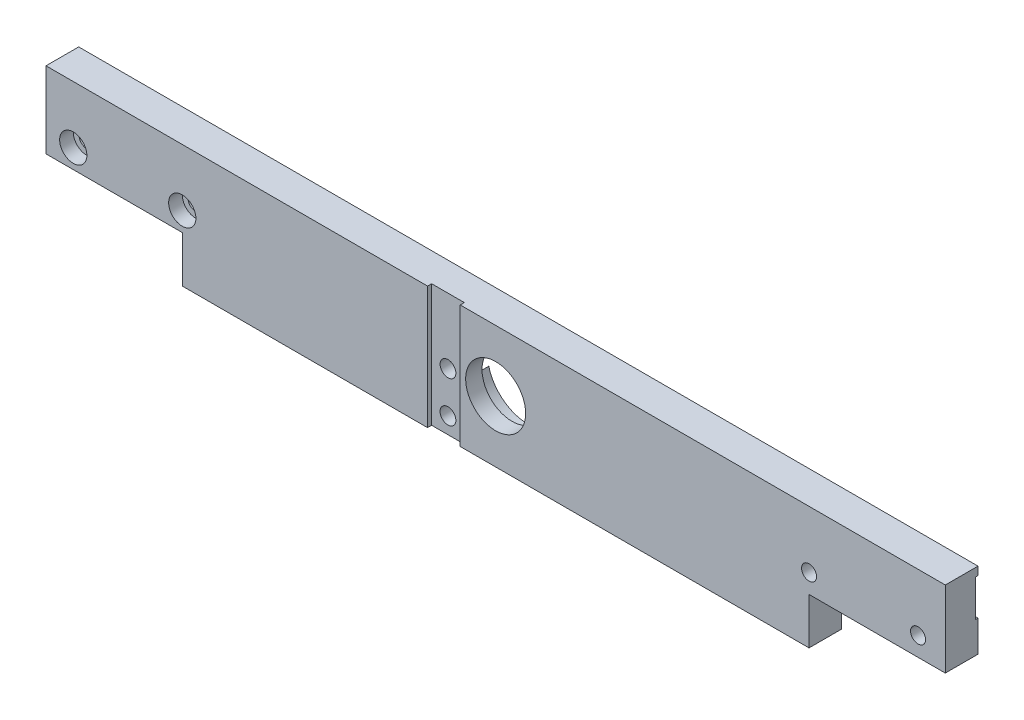
ISO-10303-21;
HEADER;
FILE_DESCRIPTION(('STEP AP214'),'2;1');
FILE_NAME('part.step','',(''),(''),'','','');
FILE_SCHEMA(('AUTOMOTIVE_DESIGN { 1 0 10303 214 1 1 1 1 }'));
ENDSEC;
DATA;
#1=APPLICATION_CONTEXT('core data for automotive mechanical design processes');
#2=APPLICATION_PROTOCOL_DEFINITION('international standard','automotive_design',2000,#1);
#3=PRODUCT_CONTEXT('',#1,'mechanical');
#4=PRODUCT('Part','Part','',(#3));
#5=PRODUCT_RELATED_PRODUCT_CATEGORY('part','',(#4));
#6=PRODUCT_DEFINITION_FORMATION('','',#4);
#7=PRODUCT_DEFINITION_CONTEXT('part definition',#1,'design');
#8=PRODUCT_DEFINITION('design','',#6,#7);
#9=PRODUCT_DEFINITION_SHAPE('','',#8);
#10=(LENGTH_UNIT() NAMED_UNIT(*) SI_UNIT(.MILLI.,.METRE.));
#11=(NAMED_UNIT(*) PLANE_ANGLE_UNIT() SI_UNIT($,.RADIAN.));
#12=(NAMED_UNIT(*) SI_UNIT($,.STERADIAN.) SOLID_ANGLE_UNIT());
#13=UNCERTAINTY_MEASURE_WITH_UNIT(LENGTH_MEASURE(1.E-05),#10,'distance_accuracy_value','');
#14=(GEOMETRIC_REPRESENTATION_CONTEXT(3) GLOBAL_UNCERTAINTY_ASSIGNED_CONTEXT((#13)) GLOBAL_UNIT_ASSIGNED_CONTEXT((#10,
#11,#12)) REPRESENTATION_CONTEXT('',''));
#15=CARTESIAN_POINT('',(0.,0.,0.));
#16=DIRECTION('',(0.,0.,1.));
#17=DIRECTION('',(1.,0.,0.));
#18=AXIS2_PLACEMENT_3D('',#15,#16,#17);
#19=CARTESIAN_POINT('',(165.,22.5,0.));
#20=DIRECTION('',(0.,0.,1.));
#21=DIRECTION('',(1.,0.,0.));
#22=AXIS2_PLACEMENT_3D('',#19,#20,#21);
#23=CYLINDRICAL_SURFACE('',#22,11.);
#24=CARTESIAN_POINT('',(165.,22.5,12.));
#25=DIRECTION('',(0.,0.,1.));
#26=DIRECTION('',(1.,0.,0.));
#27=AXIS2_PLACEMENT_3D('',#24,#25,#26);
#28=CIRCLE('',#27,11.);
#29=CARTESIAN_POINT('',(176.,22.5,12.));
#30=VERTEX_POINT('',#29);
#31=EDGE_CURVE('E281',#30,#30,#28,.T.);
#32=ORIENTED_EDGE('',*,*,#31,.T.);
#33=EDGE_LOOP('',(#32));
#34=FACE_BOUND('',#33,.T.);
#35=CARTESIAN_POINT('',(165.,22.5,6.));
#36=DIRECTION('',(0.,0.,-1.));
#37=DIRECTION('',(-1.,0.,0.));
#38=AXIS2_PLACEMENT_3D('',#35,#36,#37);
#39=CIRCLE('',#38,11.);
#40=CARTESIAN_POINT('',(154.,22.5,6.));
#41=VERTEX_POINT('',#40);
#42=EDGE_CURVE('E213',#41,#41,#39,.F.);
#43=ORIENTED_EDGE('',*,*,#42,.F.);
#44=EDGE_LOOP('',(#43));
#45=FACE_BOUND('',#44,.T.);
#46=ADVANCED_FACE('F34',(#34,#45),#23,.F.);
#47=CARTESIAN_POINT('',(0.,45.,12.));
#48=DIRECTION('',(0.,0.,-1.));
#49=DIRECTION('',(-1.,0.,0.));
#50=AXIS2_PLACEMENT_3D('',#47,#48,#49);
#51=PLANE('',#50);
#52=CARTESIAN_POINT('',(50.,24.,12.));
#53=DIRECTION('',(0.,0.,1.));
#54=DIRECTION('',(1.,0.,0.));
#55=AXIS2_PLACEMENT_3D('',#52,#53,#54);
#56=CIRCLE('',#55,5.);
#57=CARTESIAN_POINT('',(55.,24.,12.));
#58=VERTEX_POINT('',#57);
#59=EDGE_CURVE('E337',#58,#58,#56,.T.);
#60=ORIENTED_EDGE('',*,*,#59,.F.);
#61=EDGE_LOOP('',(#60));
#62=FACE_BOUND('',#61,.T.);
#63=CARTESIAN_POINT('',(10.,24.,12.));
#64=DIRECTION('',(0.,0.,1.));
#65=DIRECTION('',(1.,0.,0.));
#66=AXIS2_PLACEMENT_3D('',#63,#64,#65);
#67=CIRCLE('',#66,5.);
#68=CARTESIAN_POINT('',(15.,24.,12.));
#69=VERTEX_POINT('',#68);
#70=EDGE_CURVE('E321',#69,#69,#67,.T.);
#71=ORIENTED_EDGE('',*,*,#70,.F.);
#72=EDGE_LOOP('',(#71));
#73=FACE_BOUND('',#72,.T.);
#74=DIRECTION('',(1.,0.,0.));
#75=VECTOR('',#74,1.);
#76=CARTESIAN_POINT('',(0.,0.,12.));
#77=LINE('',#76,#75);
#78=CARTESIAN_POINT('',(50.,0.,12.));
#79=VERTEX_POINT('',#78);
#80=CARTESIAN_POINT('',(140.,0.,12.));
#81=VERTEX_POINT('',#80);
#82=EDGE_CURVE('E355',#79,#81,#77,.T.);
#83=ORIENTED_EDGE('',*,*,#82,.T.);
#84=DIRECTION('',(0.,-1.,0.));
#85=VECTOR('',#84,1.);
#86=CARTESIAN_POINT('',(140.,45.,12.));
#87=LINE('',#86,#85);
#88=CARTESIAN_POINT('',(140.,45.,12.));
#89=VERTEX_POINT('',#88);
#90=EDGE_CURVE('E239',#89,#81,#87,.T.);
#91=ORIENTED_EDGE('',*,*,#90,.F.);
#92=DIRECTION('',(-1.,0.,0.));
#93=VECTOR('',#92,1.);
#94=CARTESIAN_POINT('',(0.,45.,12.));
#95=LINE('',#94,#93);
#96=CARTESIAN_POINT('',(0.,45.,12.));
#97=VERTEX_POINT('',#96);
#98=EDGE_CURVE('E360',#89,#97,#95,.T.);
#99=ORIENTED_EDGE('',*,*,#98,.T.);
#100=DIRECTION('',(0.,-1.,0.));
#101=VECTOR('',#100,1.);
#102=CARTESIAN_POINT('',(0.,0.,12.));
#103=LINE('',#102,#101);
#104=CARTESIAN_POINT('',(0.,17.,12.));
#105=VERTEX_POINT('',#104);
#106=EDGE_CURVE('E350',#97,#105,#103,.T.);
#107=ORIENTED_EDGE('',*,*,#106,.T.);
#108=DIRECTION('',(-1.,0.,0.));
#109=VECTOR('',#108,1.);
#110=CARTESIAN_POINT('',(0.,17.,12.));
#111=LINE('',#110,#109);
#112=CARTESIAN_POINT('',(50.,17.,12.));
#113=VERTEX_POINT('',#112);
#114=EDGE_CURVE('E271',#113,#105,#111,.T.);
#115=ORIENTED_EDGE('',*,*,#114,.F.);
#116=DIRECTION('',(0.,1.,0.));
#117=VECTOR('',#116,1.);
#118=CARTESIAN_POINT('',(50.,0.,12.));
#119=LINE('',#118,#117);
#120=EDGE_CURVE('E263',#79,#113,#119,.T.);
#121=ORIENTED_EDGE('',*,*,#120,.F.);
#122=EDGE_LOOP('',(#83,#91,#99,#107,#115,#121));
#123=FACE_BOUND('',#122,.T.);
#124=ADVANCED_FACE('F428',(#62,#73,#123),#51,.F.);
#125=CARTESIAN_POINT('',(330.,28.5,0.));
#126=DIRECTION('',(0.,-1.,0.));
#127=DIRECTION('',(0.,0.,-1.));
#128=AXIS2_PLACEMENT_3D('',#125,#126,#127);
#129=PLANE('',#128);
#130=DIRECTION('',(-1.,0.,0.));
#131=VECTOR('',#130,1.);
#132=CARTESIAN_POINT('',(330.,28.5,0.));
#133=LINE('',#132,#131);
#134=CARTESIAN_POINT('',(330.,28.5,0.));
#135=VERTEX_POINT('',#134);
#136=CARTESIAN_POINT('',(178.747727084868,28.5,0.));
#137=VERTEX_POINT('',#136);
#138=EDGE_CURVE('E323',#135,#137,#133,.T.);
#139=ORIENTED_EDGE('',*,*,#138,.T.);
#140=DIRECTION('',(0.,0.,-1.));
#141=VECTOR('',#140,1.);
#142=CARTESIAN_POINT('',(178.747727084868,28.5,6.));
#143=LINE('',#142,#141);
#144=CARTESIAN_POINT('',(178.747727084868,28.5,1.));
#145=VERTEX_POINT('',#144);
#146=EDGE_CURVE('E218',#137,#145,#143,.F.);
#147=ORIENTED_EDGE('',*,*,#146,.T.);
#148=DIRECTION('',(-1.,0.,0.));
#149=VECTOR('',#148,1.);
#150=CARTESIAN_POINT('',(330.,28.5,1.));
#151=LINE('',#150,#149);
#152=CARTESIAN_POINT('',(330.,28.5,1.));
#153=VERTEX_POINT('',#152);
#154=EDGE_CURVE('E318',#153,#145,#151,.T.);
#155=ORIENTED_EDGE('',*,*,#154,.F.);
#156=DIRECTION('',(0.,0.,1.));
#157=VECTOR('',#156,1.);
#158=CARTESIAN_POINT('',(330.,28.5,0.));
#159=LINE('',#158,#157);
#160=EDGE_CURVE('E306',#135,#153,#159,.T.);
#161=ORIENTED_EDGE('',*,*,#160,.F.);
#162=EDGE_LOOP('',(#139,#147,#155,#161));
#163=FACE_BOUND('',#162,.T.);
#164=ADVANCED_FACE('F394',(#163),#129,.F.);
#165=CARTESIAN_POINT('',(330.,45.,1.));
#166=DIRECTION('',(0.,0.,1.));
#167=DIRECTION('',(0.,-1.,0.));
#168=AXIS2_PLACEMENT_3D('',#165,#166,#167);
#169=PLANE('',#168);
#170=ORIENTED_EDGE('',*,*,#154,.T.);
#171=CARTESIAN_POINT('',(165.,22.5,1.));
#172=DIRECTION('',(0.,0.,1.));
#173=DIRECTION('',(0.,-1.,0.));
#174=AXIS2_PLACEMENT_3D('',#171,#172,#173);
#175=CIRCLE('',#174,15.);
#176=CARTESIAN_POINT('',(151.252272915132,28.5,1.));
#177=VERTEX_POINT('',#176);
#178=EDGE_CURVE('E215',#145,#177,#175,.T.);
#179=ORIENTED_EDGE('',*,*,#178,.T.);
#180=CARTESIAN_POINT('',(0.,28.5,1.));
#181=VERTEX_POINT('',#180);
#182=EDGE_CURVE('E322',#177,#181,#151,.T.);
#183=ORIENTED_EDGE('',*,*,#182,.T.);
#184=DIRECTION('',(0.,1.,0.));
#185=VECTOR('',#184,1.);
#186=CARTESIAN_POINT('',(0.,45.,1.));
#187=LINE('',#186,#185);
#188=CARTESIAN_POINT('',(0.,42.,1.));
#189=VERTEX_POINT('',#188);
#190=EDGE_CURVE('E310',#181,#189,#187,.T.);
#191=ORIENTED_EDGE('',*,*,#190,.T.);
#192=DIRECTION('',(-1.,0.,0.));
#193=VECTOR('',#192,1.);
#194=CARTESIAN_POINT('',(330.,42.,1.));
#195=LINE('',#194,#193);
#196=CARTESIAN_POINT('',(330.,42.,1.));
#197=VERTEX_POINT('',#196);
#198=EDGE_CURVE('E287',#197,#189,#195,.T.);
#199=ORIENTED_EDGE('',*,*,#198,.F.);
#200=DIRECTION('',(0.,1.,0.));
#201=VECTOR('',#200,1.);
#202=CARTESIAN_POINT('',(330.,45.,1.));
#203=LINE('',#202,#201);
#204=EDGE_CURVE('E309',#153,#197,#203,.T.);
#205=ORIENTED_EDGE('',*,*,#204,.F.);
#206=EDGE_LOOP('',(#170,#179,#183,#191,#199,#205));
#207=FACE_BOUND('',#206,.T.);
#208=ADVANCED_FACE('F391',(#207),#169,.F.);
#209=CARTESIAN_POINT('',(0.,0.,12.));
#210=DIRECTION('',(1.,0.,0.));
#211=DIRECTION('',(0.,0.,-1.));
#212=AXIS2_PLACEMENT_3D('',#209,#210,#211);
#213=PLANE('',#212);
#214=DIRECTION('',(0.,-1.,0.));
#215=VECTOR('',#214,1.);
#216=CARTESIAN_POINT('',(0.,0.,0.));
#217=LINE('',#216,#215);
#218=CARTESIAN_POINT('',(0.,28.5,0.));
#219=VERTEX_POINT('',#218);
#220=CARTESIAN_POINT('',(0.,17.,0.));
#221=VERTEX_POINT('',#220);
#222=EDGE_CURVE('E349',#219,#221,#217,.T.);
#223=ORIENTED_EDGE('',*,*,#222,.T.);
#224=DIRECTION('',(0.,0.,1.));
#225=VECTOR('',#224,1.);
#226=CARTESIAN_POINT('',(0.,17.,0.));
#227=LINE('',#226,#225);
#228=EDGE_CURVE('E278',#221,#105,#227,.T.);
#229=ORIENTED_EDGE('',*,*,#228,.T.);
#230=ORIENTED_EDGE('',*,*,#106,.F.);
#231=DIRECTION('',(0.,0.,-1.));
#232=VECTOR('',#231,1.);
#233=CARTESIAN_POINT('',(0.,45.,12.));
#234=LINE('',#233,#232);
#235=CARTESIAN_POINT('',(0.,45.,0.));
#236=VERTEX_POINT('',#235);
#237=EDGE_CURVE('E364',#97,#236,#234,.T.);
#238=ORIENTED_EDGE('',*,*,#237,.T.);
#239=DIRECTION('',(0.,1.,0.));
#240=VECTOR('',#239,1.);
#241=CARTESIAN_POINT('',(0.,45.,0.));
#242=LINE('',#241,#240);
#243=CARTESIAN_POINT('',(0.,42.,0.));
#244=VERTEX_POINT('',#243);
#245=EDGE_CURVE('E293',#244,#236,#242,.T.);
#246=ORIENTED_EDGE('',*,*,#245,.F.);
#247=DIRECTION('',(0.,0.,1.));
#248=VECTOR('',#247,1.);
#249=CARTESIAN_POINT('',(0.,42.,0.));
#250=LINE('',#249,#248);
#251=EDGE_CURVE('E299',#244,#189,#250,.T.);
#252=ORIENTED_EDGE('',*,*,#251,.T.);
#253=ORIENTED_EDGE('',*,*,#190,.F.);
#254=DIRECTION('',(0.,0.,1.));
#255=VECTOR('',#254,1.);
#256=CARTESIAN_POINT('',(0.,28.5,0.));
#257=LINE('',#256,#255);
#258=EDGE_CURVE('E305',#219,#181,#257,.T.);
#259=ORIENTED_EDGE('',*,*,#258,.F.);
#260=EDGE_LOOP('',(#223,#229,#230,#238,#246,#252,#253,#259));
#261=FACE_BOUND('',#260,.T.);
#262=ADVANCED_FACE('F36',(#261),#213,.F.);
#263=CARTESIAN_POINT('',(0.,0.,12.));
#264=DIRECTION('',(0.,1.,0.));
#265=DIRECTION('',(0.,0.,1.));
#266=AXIS2_PLACEMENT_3D('',#263,#264,#265);
#267=PLANE('',#266);
#268=DIRECTION('',(1.,0.,0.));
#269=VECTOR('',#268,1.);
#270=CARTESIAN_POINT('',(140.,0.,10.5));
#271=LINE('',#270,#269);
#272=CARTESIAN_POINT('',(140.,0.,10.5));
#273=VERTEX_POINT('',#272);
#274=CARTESIAN_POINT('',(152.,0.,10.5));
#275=VERTEX_POINT('',#274);
#276=EDGE_CURVE('E235',#273,#275,#271,.T.);
#277=ORIENTED_EDGE('',*,*,#276,.F.);
#278=DIRECTION('',(0.,0.,-1.));
#279=VECTOR('',#278,1.);
#280=CARTESIAN_POINT('',(140.,0.,12.));
#281=LINE('',#280,#279);
#282=EDGE_CURVE('E221',#81,#273,#281,.T.);
#283=ORIENTED_EDGE('',*,*,#282,.F.);
#284=ORIENTED_EDGE('',*,*,#82,.F.);
#285=DIRECTION('',(0.,0.,1.));
#286=VECTOR('',#285,1.);
#287=CARTESIAN_POINT('',(50.,0.,0.));
#288=LINE('',#287,#286);
#289=CARTESIAN_POINT('',(50.,0.,0.));
#290=VERTEX_POINT('',#289);
#291=EDGE_CURVE('E274',#290,#79,#288,.T.);
#292=ORIENTED_EDGE('',*,*,#291,.F.);
#293=DIRECTION('',(1.,0.,0.));
#294=VECTOR('',#293,1.);
#295=CARTESIAN_POINT('',(0.,0.,0.));
#296=LINE('',#295,#294);
#297=CARTESIAN_POINT('',(280.,0.,0.));
#298=VERTEX_POINT('',#297);
#299=EDGE_CURVE('E367',#290,#298,#296,.T.);
#300=ORIENTED_EDGE('',*,*,#299,.T.);
#301=DIRECTION('',(0.,0.,1.));
#302=VECTOR('',#301,1.);
#303=CARTESIAN_POINT('',(280.,0.,0.));
#304=LINE('',#303,#302);
#305=CARTESIAN_POINT('',(280.,0.,12.));
#306=VERTEX_POINT('',#305);
#307=EDGE_CURVE('E260',#298,#306,#304,.T.);
#308=ORIENTED_EDGE('',*,*,#307,.T.);
#309=CARTESIAN_POINT('',(152.,0.,12.));
#310=VERTEX_POINT('',#309);
#311=EDGE_CURVE('E353',#310,#306,#77,.T.);
#312=ORIENTED_EDGE('',*,*,#311,.F.);
#313=DIRECTION('',(0.,0.,1.));
#314=VECTOR('',#313,1.);
#315=CARTESIAN_POINT('',(152.,0.,12.));
#316=LINE('',#315,#314);
#317=EDGE_CURVE('E226',#275,#310,#316,.T.);
#318=ORIENTED_EDGE('',*,*,#317,.F.);
#319=EDGE_LOOP('',(#277,#283,#284,#292,#300,#308,#312,#318));
#320=FACE_BOUND('',#319,.T.);
#321=ADVANCED_FACE('F492',(#320),#267,.F.);
#322=CARTESIAN_POINT('',(330.,0.,12.));
#323=DIRECTION('',(-1.,0.,0.));
#324=DIRECTION('',(0.,0.,1.));
#325=AXIS2_PLACEMENT_3D('',#322,#323,#324);
#326=PLANE('',#325);
#327=DIRECTION('',(0.,1.,0.));
#328=VECTOR('',#327,1.);
#329=CARTESIAN_POINT('',(330.,0.,12.));
#330=LINE('',#329,#328);
#331=CARTESIAN_POINT('',(330.,17.,12.));
#332=VERTEX_POINT('',#331);
#333=CARTESIAN_POINT('',(330.,45.,12.));
#334=VERTEX_POINT('',#333);
#335=EDGE_CURVE('E358',#332,#334,#330,.T.);
#336=ORIENTED_EDGE('',*,*,#335,.F.);
#337=DIRECTION('',(0.,0.,1.));
#338=VECTOR('',#337,1.);
#339=CARTESIAN_POINT('',(330.,17.,0.));
#340=LINE('',#339,#338);
#341=CARTESIAN_POINT('',(330.,17.,0.));
#342=VERTEX_POINT('',#341);
#343=EDGE_CURVE('E255',#342,#332,#340,.T.);
#344=ORIENTED_EDGE('',*,*,#343,.F.);
#345=DIRECTION('',(0.,1.,0.));
#346=VECTOR('',#345,1.);
#347=CARTESIAN_POINT('',(330.,0.,0.));
#348=LINE('',#347,#346);
#349=EDGE_CURVE('E354',#342,#135,#348,.T.);
#350=ORIENTED_EDGE('',*,*,#349,.T.);
#351=ORIENTED_EDGE('',*,*,#160,.T.);
#352=ORIENTED_EDGE('',*,*,#204,.T.);
#353=DIRECTION('',(0.,0.,1.));
#354=VECTOR('',#353,1.);
#355=CARTESIAN_POINT('',(330.,42.,0.));
#356=LINE('',#355,#354);
#357=CARTESIAN_POINT('',(330.,42.,0.));
#358=VERTEX_POINT('',#357);
#359=EDGE_CURVE('E303',#358,#197,#356,.T.);
#360=ORIENTED_EDGE('',*,*,#359,.F.);
#361=DIRECTION('',(0.,-1.,0.));
#362=VECTOR('',#361,1.);
#363=CARTESIAN_POINT('',(330.,45.,0.));
#364=LINE('',#363,#362);
#365=CARTESIAN_POINT('',(330.,45.,0.));
#366=VERTEX_POINT('',#365);
#367=EDGE_CURVE('E288',#366,#358,#364,.T.);
#368=ORIENTED_EDGE('',*,*,#367,.F.);
#369=DIRECTION('',(0.,0.,-1.));
#370=VECTOR('',#369,1.);
#371=CARTESIAN_POINT('',(330.,45.,12.));
#372=LINE('',#371,#370);
#373=EDGE_CURVE('E372',#334,#366,#372,.T.);
#374=ORIENTED_EDGE('',*,*,#373,.F.);
#375=EDGE_LOOP('',(#336,#344,#350,#351,#352,#360,#368,#374));
#376=FACE_BOUND('',#375,.T.);
#377=ADVANCED_FACE('F506',(#376),#326,.F.);
#378=CARTESIAN_POINT('',(0.,45.,12.));
#379=DIRECTION('',(0.,-1.,0.));
#380=DIRECTION('',(0.,0.,-1.));
#381=AXIS2_PLACEMENT_3D('',#378,#379,#380);
#382=PLANE('',#381);
#383=ORIENTED_EDGE('',*,*,#98,.F.);
#384=DIRECTION('',(0.,0.,-1.));
#385=VECTOR('',#384,1.);
#386=CARTESIAN_POINT('',(140.,45.,12.));
#387=LINE('',#386,#385);
#388=CARTESIAN_POINT('',(140.,45.,10.5));
#389=VERTEX_POINT('',#388);
#390=EDGE_CURVE('E222',#89,#389,#387,.T.);
#391=ORIENTED_EDGE('',*,*,#390,.T.);
#392=DIRECTION('',(1.,0.,0.));
#393=VECTOR('',#392,1.);
#394=CARTESIAN_POINT('',(140.,45.,10.5));
#395=LINE('',#394,#393);
#396=CARTESIAN_POINT('',(152.,45.,10.5));
#397=VERTEX_POINT('',#396);
#398=EDGE_CURVE('E225',#389,#397,#395,.T.);
#399=ORIENTED_EDGE('',*,*,#398,.T.);
#400=DIRECTION('',(0.,0.,1.));
#401=VECTOR('',#400,1.);
#402=CARTESIAN_POINT('',(152.,45.,12.));
#403=LINE('',#402,#401);
#404=CARTESIAN_POINT('',(152.,45.,12.));
#405=VERTEX_POINT('',#404);
#406=EDGE_CURVE('E229',#397,#405,#403,.T.);
#407=ORIENTED_EDGE('',*,*,#406,.T.);
#408=EDGE_CURVE('E361',#334,#405,#95,.T.);
#409=ORIENTED_EDGE('',*,*,#408,.F.);
#410=ORIENTED_EDGE('',*,*,#373,.T.);
#411=DIRECTION('',(1.,0.,0.));
#412=VECTOR('',#411,1.);
#413=CARTESIAN_POINT('',(330.,45.,0.));
#414=LINE('',#413,#412);
#415=EDGE_CURVE('E296',#236,#366,#414,.T.);
#416=ORIENTED_EDGE('',*,*,#415,.F.);
#417=ORIENTED_EDGE('',*,*,#237,.F.);
#418=EDGE_LOOP('',(#383,#391,#399,#407,#409,#410,#416,#417));
#419=FACE_BOUND('',#418,.T.);
#420=ADVANCED_FACE('F425',(#419),#382,.F.);
#421=CARTESIAN_POINT('',(320.,24.,12.));
#422=DIRECTION('',(0.,0.,1.));
#423=DIRECTION('',(1.,0.,0.));
#424=AXIS2_PLACEMENT_3D('',#421,#422,#423);
#425=CIRCLE('',#424,2.74999999999998);
#426=CARTESIAN_POINT('',(322.75,24.,12.));
#427=VERTEX_POINT('',#426);
#428=EDGE_CURVE('E190',#427,#427,#425,.T.);
#429=ORIENTED_EDGE('',*,*,#428,.F.);
#430=EDGE_LOOP('',(#429));
#431=FACE_BOUND('',#430,.T.);
#432=CARTESIAN_POINT('',(280.,24.,12.));
#433=DIRECTION('',(0.,0.,1.));
#434=DIRECTION('',(1.,0.,0.));
#435=AXIS2_PLACEMENT_3D('',#432,#433,#434);
#436=CIRCLE('',#435,2.74999999999998);
#437=CARTESIAN_POINT('',(282.75,24.,12.));
#438=VERTEX_POINT('',#437);
#439=EDGE_CURVE('E203',#438,#438,#436,.T.);
#440=ORIENTED_EDGE('',*,*,#439,.F.);
#441=EDGE_LOOP('',(#440));
#442=FACE_BOUND('',#441,.T.);
#443=ORIENTED_EDGE('',*,*,#31,.F.);
#444=EDGE_LOOP('',(#443));
#445=FACE_BOUND('',#444,.T.);
#446=ORIENTED_EDGE('',*,*,#408,.T.);
#447=DIRECTION('',(0.,-1.,0.));
#448=VECTOR('',#447,1.);
#449=CARTESIAN_POINT('',(152.,45.,12.));
#450=LINE('',#449,#448);
#451=EDGE_CURVE('E242',#405,#310,#450,.T.);
#452=ORIENTED_EDGE('',*,*,#451,.T.);
#453=ORIENTED_EDGE('',*,*,#311,.T.);
#454=DIRECTION('',(0.,-1.,0.));
#455=VECTOR('',#454,1.);
#456=CARTESIAN_POINT('',(280.,0.,12.));
#457=LINE('',#456,#455);
#458=CARTESIAN_POINT('',(280.,17.,12.));
#459=VERTEX_POINT('',#458);
#460=EDGE_CURVE('E252',#459,#306,#457,.T.);
#461=ORIENTED_EDGE('',*,*,#460,.F.);
#462=DIRECTION('',(-1.,0.,0.));
#463=VECTOR('',#462,1.);
#464=CARTESIAN_POINT('',(330.,17.,12.));
#465=LINE('',#464,#463);
#466=EDGE_CURVE('E241',#332,#459,#465,.T.);
#467=ORIENTED_EDGE('',*,*,#466,.F.);
#468=ORIENTED_EDGE('',*,*,#335,.T.);
#469=EDGE_LOOP('',(#446,#452,#453,#461,#467,#468));
#470=FACE_BOUND('',#469,.T.);
#471=ADVANCED_FACE('F414',(#431,#442,#445,#470),#51,.F.);
#472=CARTESIAN_POINT('',(0.,45.,0.));
#473=DIRECTION('',(0.,0.,-1.));
#474=DIRECTION('',(-1.,0.,0.));
#475=AXIS2_PLACEMENT_3D('',#472,#473,#474);
#476=PLANE('',#475);
#477=CARTESIAN_POINT('',(146.,6.,0.));
#478=DIRECTION('',(0.,0.,-1.));
#479=DIRECTION('',(-1.,0.,0.));
#480=AXIS2_PLACEMENT_3D('',#477,#478,#479);
#481=CIRCLE('',#480,5.);
#482=CARTESIAN_POINT('',(141.,6.,0.));
#483=VERTEX_POINT('',#482);
#484=EDGE_CURVE('E406',#483,#483,#481,.T.);
#485=ORIENTED_EDGE('',*,*,#484,.F.);
#486=EDGE_LOOP('',(#485));
#487=FACE_BOUND('',#486,.T.);
#488=CARTESIAN_POINT('',(146.,21.,0.));
#489=DIRECTION('',(0.,0.,-1.));
#490=DIRECTION('',(-1.,0.,0.));
#491=AXIS2_PLACEMENT_3D('',#488,#489,#490);
#492=CIRCLE('',#491,5.);
#493=CARTESIAN_POINT('',(150.472523162715,18.764706605615,0.));
#494=VERTEX_POINT('',#493);
#495=CARTESIAN_POINT('',(150.066361902667,23.9094158995467,0.));
#496=VERTEX_POINT('',#495);
#497=EDGE_CURVE('E180',#494,#496,#492,.T.);
#498=ORIENTED_EDGE('',*,*,#497,.F.);
#499=CARTESIAN_POINT('',(165.,22.5,0.));
#500=DIRECTION('',(0.,0.,-1.));
#501=DIRECTION('',(-1.,0.,0.));
#502=AXIS2_PLACEMENT_3D('',#499,#500,#501);
#503=CIRCLE('',#502,15.);
#504=EDGE_CURVE('E185',#137,#494,#503,.T.);
#505=ORIENTED_EDGE('',*,*,#504,.F.);
#506=ORIENTED_EDGE('',*,*,#138,.F.);
#507=ORIENTED_EDGE('',*,*,#349,.F.);
#508=DIRECTION('',(-1.,0.,0.));
#509=VECTOR('',#508,1.);
#510=CARTESIAN_POINT('',(330.,17.,0.));
#511=LINE('',#510,#509);
#512=CARTESIAN_POINT('',(280.,17.,0.));
#513=VERTEX_POINT('',#512);
#514=EDGE_CURVE('E248',#342,#513,#511,.T.);
#515=ORIENTED_EDGE('',*,*,#514,.T.);
#516=DIRECTION('',(0.,-1.,0.));
#517=VECTOR('',#516,1.);
#518=CARTESIAN_POINT('',(280.,0.,0.));
#519=LINE('',#518,#517);
#520=EDGE_CURVE('E251',#513,#298,#519,.T.);
#521=ORIENTED_EDGE('',*,*,#520,.T.);
#522=ORIENTED_EDGE('',*,*,#299,.F.);
#523=DIRECTION('',(0.,1.,0.));
#524=VECTOR('',#523,1.);
#525=CARTESIAN_POINT('',(50.,0.,0.));
#526=LINE('',#525,#524);
#527=CARTESIAN_POINT('',(50.,17.,0.));
#528=VERTEX_POINT('',#527);
#529=EDGE_CURVE('E267',#290,#528,#526,.T.);
#530=ORIENTED_EDGE('',*,*,#529,.T.);
#531=DIRECTION('',(-1.,0.,0.));
#532=VECTOR('',#531,1.);
#533=CARTESIAN_POINT('',(0.,17.,0.));
#534=LINE('',#533,#532);
#535=EDGE_CURVE('E270',#528,#221,#534,.T.);
#536=ORIENTED_EDGE('',*,*,#535,.T.);
#537=ORIENTED_EDGE('',*,*,#222,.F.);
#538=CARTESIAN_POINT('',(151.252272915132,28.5,0.));
#539=VERTEX_POINT('',#538);
#540=EDGE_CURVE('E313',#539,#219,#133,.T.);
#541=ORIENTED_EDGE('',*,*,#540,.F.);
#542=EDGE_CURVE('E57',#496,#539,#503,.T.);
#543=ORIENTED_EDGE('',*,*,#542,.F.);
#544=EDGE_LOOP('',(#498,#505,#506,#507,#515,#521,#522,#530,#536,#537,#541,#543));
#545=FACE_BOUND('',#544,.T.);
#546=CARTESIAN_POINT('',(320.,24.,0.));
#547=DIRECTION('',(0.,0.,1.));
#548=DIRECTION('',(1.,0.,0.));
#549=AXIS2_PLACEMENT_3D('',#546,#547,#548);
#550=CIRCLE('',#549,2.74999999999998);
#551=CARTESIAN_POINT('',(322.75,24.,0.));
#552=VERTEX_POINT('',#551);
#553=EDGE_CURVE('E194',#552,#552,#550,.T.);
#554=ORIENTED_EDGE('',*,*,#553,.T.);
#555=EDGE_LOOP('',(#554));
#556=FACE_BOUND('',#555,.T.);
#557=CARTESIAN_POINT('',(280.,24.,0.));
#558=DIRECTION('',(0.,0.,1.));
#559=DIRECTION('',(1.,0.,0.));
#560=AXIS2_PLACEMENT_3D('',#557,#558,#559);
#561=CIRCLE('',#560,2.74999999999998);
#562=CARTESIAN_POINT('',(282.75,24.,0.));
#563=VERTEX_POINT('',#562);
#564=EDGE_CURVE('E205',#563,#563,#561,.T.);
#565=ORIENTED_EDGE('',*,*,#564,.T.);
#566=EDGE_LOOP('',(#565));
#567=FACE_BOUND('',#566,.T.);
#568=CARTESIAN_POINT('',(10.,24.,0.));
#569=DIRECTION('',(0.,0.,1.));
#570=DIRECTION('',(1.,0.,0.));
#571=AXIS2_PLACEMENT_3D('',#568,#569,#570);
#572=CIRCLE('',#571,2.9);
#573=CARTESIAN_POINT('',(12.9,24.,0.));
#574=VERTEX_POINT('',#573);
#575=EDGE_CURVE('E334',#574,#574,#572,.T.);
#576=ORIENTED_EDGE('',*,*,#575,.T.);
#577=EDGE_LOOP('',(#576));
#578=FACE_BOUND('',#577,.T.);
#579=CARTESIAN_POINT('',(50.,24.,0.));
#580=DIRECTION('',(0.,0.,1.));
#581=DIRECTION('',(1.,0.,0.));
#582=AXIS2_PLACEMENT_3D('',#579,#580,#581);
#583=CIRCLE('',#582,2.9);
#584=CARTESIAN_POINT('',(52.9,24.,0.));
#585=VERTEX_POINT('',#584);
#586=EDGE_CURVE('E346',#585,#585,#583,.T.);
#587=ORIENTED_EDGE('',*,*,#586,.T.);
#588=EDGE_LOOP('',(#587));
#589=FACE_BOUND('',#588,.T.);
#590=ADVANCED_FACE('F382',(#487,#545,#556,#567,#578,#589),#476,.T.);
#591=CARTESIAN_POINT('',(50.,24.,12.));
#592=DIRECTION('',(0.,0.,1.));
#593=DIRECTION('',(1.,0.,0.));
#594=AXIS2_PLACEMENT_3D('',#591,#592,#593);
#595=CYLINDRICAL_SURFACE('',#594,2.9);
#596=ORIENTED_EDGE('',*,*,#586,.F.);
#597=EDGE_LOOP('',(#596));
#598=FACE_BOUND('',#597,.T.);
#599=CARTESIAN_POINT('',(50.,24.,7.));
#600=DIRECTION('',(0.,0.,1.));
#601=DIRECTION('',(1.,0.,0.));
#602=AXIS2_PLACEMENT_3D('',#599,#600,#601);
#603=CIRCLE('',#602,2.9);
#604=CARTESIAN_POINT('',(52.9,24.,7.));
#605=VERTEX_POINT('',#604);
#606=EDGE_CURVE('E343',#605,#605,#603,.T.);
#607=ORIENTED_EDGE('',*,*,#606,.T.);
#608=EDGE_LOOP('',(#607));
#609=FACE_BOUND('',#608,.T.);
#610=ADVANCED_FACE('F413',(#598,#609),#595,.F.);
#611=CARTESIAN_POINT('',(52.9,24.,7.));
#612=DIRECTION('',(0.,0.,-1.));
#613=DIRECTION('',(-1.,0.,0.));
#614=AXIS2_PLACEMENT_3D('',#611,#612,#613);
#615=PLANE('',#614);
#616=ORIENTED_EDGE('',*,*,#606,.F.);
#617=EDGE_LOOP('',(#616));
#618=FACE_BOUND('',#617,.T.);
#619=CARTESIAN_POINT('',(50.,24.,7.));
#620=DIRECTION('',(0.,0.,1.));
#621=DIRECTION('',(1.,0.,0.));
#622=AXIS2_PLACEMENT_3D('',#619,#620,#621);
#623=CIRCLE('',#622,5.);
#624=CARTESIAN_POINT('',(55.,24.,7.));
#625=VERTEX_POINT('',#624);
#626=EDGE_CURVE('E340',#625,#625,#623,.T.);
#627=ORIENTED_EDGE('',*,*,#626,.T.);
#628=EDGE_LOOP('',(#627));
#629=FACE_BOUND('',#628,.T.);
#630=ADVANCED_FACE('F421',(#618,#629),#615,.F.);
#631=CARTESIAN_POINT('',(50.,24.,12.));
#632=DIRECTION('',(0.,0.,1.));
#633=DIRECTION('',(1.,0.,0.));
#634=AXIS2_PLACEMENT_3D('',#631,#632,#633);
#635=CYLINDRICAL_SURFACE('',#634,5.);
#636=ORIENTED_EDGE('',*,*,#626,.F.);
#637=EDGE_LOOP('',(#636));
#638=FACE_BOUND('',#637,.T.);
#639=ORIENTED_EDGE('',*,*,#59,.T.);
#640=EDGE_LOOP('',(#639));
#641=FACE_BOUND('',#640,.T.);
#642=ADVANCED_FACE('F466',(#638,#641),#635,.F.);
#643=CARTESIAN_POINT('',(10.,24.,12.));
#644=DIRECTION('',(0.,0.,1.));
#645=DIRECTION('',(1.,0.,0.));
#646=AXIS2_PLACEMENT_3D('',#643,#644,#645);
#647=CYLINDRICAL_SURFACE('',#646,2.9);
#648=ORIENTED_EDGE('',*,*,#575,.F.);
#649=EDGE_LOOP('',(#648));
#650=FACE_BOUND('',#649,.T.);
#651=CARTESIAN_POINT('',(10.,24.,7.));
#652=DIRECTION('',(0.,0.,1.));
#653=DIRECTION('',(1.,0.,0.));
#654=AXIS2_PLACEMENT_3D('',#651,#652,#653);
#655=CIRCLE('',#654,2.9);
#656=CARTESIAN_POINT('',(12.9,24.,7.));
#657=VERTEX_POINT('',#656);
#658=EDGE_CURVE('E331',#657,#657,#655,.T.);
#659=ORIENTED_EDGE('',*,*,#658,.T.);
#660=EDGE_LOOP('',(#659));
#661=FACE_BOUND('',#660,.T.);
#662=ADVANCED_FACE('F462',(#650,#661),#647,.F.);
#663=CARTESIAN_POINT('',(12.9,24.,7.));
#664=DIRECTION('',(0.,0.,-1.));
#665=DIRECTION('',(-1.,0.,0.));
#666=AXIS2_PLACEMENT_3D('',#663,#664,#665);
#667=PLANE('',#666);
#668=ORIENTED_EDGE('',*,*,#658,.F.);
#669=EDGE_LOOP('',(#668));
#670=FACE_BOUND('',#669,.T.);
#671=CARTESIAN_POINT('',(10.,24.,7.));
#672=DIRECTION('',(0.,0.,1.));
#673=DIRECTION('',(1.,0.,0.));
#674=AXIS2_PLACEMENT_3D('',#671,#672,#673);
#675=CIRCLE('',#674,5.);
#676=CARTESIAN_POINT('',(15.,24.,7.));
#677=VERTEX_POINT('',#676);
#678=EDGE_CURVE('E328',#677,#677,#675,.T.);
#679=ORIENTED_EDGE('',*,*,#678,.T.);
#680=EDGE_LOOP('',(#679));
#681=FACE_BOUND('',#680,.T.);
#682=ADVANCED_FACE('F458',(#670,#681),#667,.F.);
#683=CARTESIAN_POINT('',(10.,24.,12.));
#684=DIRECTION('',(0.,0.,1.));
#685=DIRECTION('',(1.,0.,0.));
#686=AXIS2_PLACEMENT_3D('',#683,#684,#685);
#687=CYLINDRICAL_SURFACE('',#686,5.);
#688=ORIENTED_EDGE('',*,*,#678,.F.);
#689=EDGE_LOOP('',(#688));
#690=FACE_BOUND('',#689,.T.);
#691=ORIENTED_EDGE('',*,*,#70,.T.);
#692=EDGE_LOOP('',(#691));
#693=FACE_BOUND('',#692,.T.);
#694=ADVANCED_FACE('F455',(#690,#693),#687,.F.);
#695=ORIENTED_EDGE('',*,*,#182,.F.);
#696=DIRECTION('',(0.,0.,-1.));
#697=VECTOR('',#696,1.);
#698=CARTESIAN_POINT('',(151.252272915132,28.5,6.));
#699=LINE('',#698,#697);
#700=EDGE_CURVE('E174',#177,#539,#699,.T.);
#701=ORIENTED_EDGE('',*,*,#700,.T.);
#702=ORIENTED_EDGE('',*,*,#540,.T.);
#703=ORIENTED_EDGE('',*,*,#258,.T.);
#704=EDGE_LOOP('',(#695,#701,#702,#703));
#705=FACE_BOUND('',#704,.T.);
#706=ADVANCED_FACE('F378',(#705),#129,.F.);
#707=CARTESIAN_POINT('',(330.,42.,0.));
#708=DIRECTION('',(0.,1.,0.));
#709=DIRECTION('',(0.,0.,1.));
#710=AXIS2_PLACEMENT_3D('',#707,#708,#709);
#711=PLANE('',#710);
#712=ORIENTED_EDGE('',*,*,#198,.T.);
#713=ORIENTED_EDGE('',*,*,#251,.F.);
#714=DIRECTION('',(-1.,0.,0.));
#715=VECTOR('',#714,1.);
#716=CARTESIAN_POINT('',(330.,42.,0.));
#717=LINE('',#716,#715);
#718=EDGE_CURVE('E291',#358,#244,#717,.T.);
#719=ORIENTED_EDGE('',*,*,#718,.F.);
#720=ORIENTED_EDGE('',*,*,#359,.T.);
#721=EDGE_LOOP('',(#712,#713,#719,#720));
#722=FACE_BOUND('',#721,.T.);
#723=ADVANCED_FACE('F446',(#722),#711,.F.);
#724=CARTESIAN_POINT('',(330.,42.,0.));
#725=DIRECTION('',(0.,0.,-1.));
#726=DIRECTION('',(0.,1.,0.));
#727=AXIS2_PLACEMENT_3D('',#724,#725,#726);
#728=PLANE('',#727);
#729=ORIENTED_EDGE('',*,*,#367,.T.);
#730=ORIENTED_EDGE('',*,*,#718,.T.);
#731=ORIENTED_EDGE('',*,*,#245,.T.);
#732=ORIENTED_EDGE('',*,*,#415,.T.);
#733=EDGE_LOOP('',(#729,#730,#731,#732));
#734=FACE_BOUND('',#733,.T.);
#735=ADVANCED_FACE('F442',(#734),#728,.T.);
#736=CARTESIAN_POINT('',(0.,17.,0.));
#737=DIRECTION('',(0.,1.,0.));
#738=DIRECTION('',(0.,0.,1.));
#739=AXIS2_PLACEMENT_3D('',#736,#737,#738);
#740=PLANE('',#739);
#741=ORIENTED_EDGE('',*,*,#114,.T.);
#742=ORIENTED_EDGE('',*,*,#228,.F.);
#743=ORIENTED_EDGE('',*,*,#535,.F.);
#744=DIRECTION('',(0.,0.,1.));
#745=VECTOR('',#744,1.);
#746=CARTESIAN_POINT('',(50.,17.,0.));
#747=LINE('',#746,#745);
#748=EDGE_CURVE('E282',#528,#113,#747,.T.);
#749=ORIENTED_EDGE('',*,*,#748,.T.);
#750=EDGE_LOOP('',(#741,#742,#743,#749));
#751=FACE_BOUND('',#750,.T.);
#752=ADVANCED_FACE('F445',(#751),#740,.F.);
#753=CARTESIAN_POINT('',(50.,0.,0.));
#754=DIRECTION('',(1.,0.,0.));
#755=DIRECTION('',(0.,0.,-1.));
#756=AXIS2_PLACEMENT_3D('',#753,#754,#755);
#757=PLANE('',#756);
#758=ORIENTED_EDGE('',*,*,#120,.T.);
#759=ORIENTED_EDGE('',*,*,#748,.F.);
#760=ORIENTED_EDGE('',*,*,#529,.F.);
#761=ORIENTED_EDGE('',*,*,#291,.T.);
#762=EDGE_LOOP('',(#758,#759,#760,#761));
#763=FACE_BOUND('',#762,.T.);
#764=ADVANCED_FACE('F440',(#763),#757,.F.);
#765=CARTESIAN_POINT('',(280.,0.,0.));
#766=DIRECTION('',(-1.,0.,0.));
#767=DIRECTION('',(0.,0.,1.));
#768=AXIS2_PLACEMENT_3D('',#765,#766,#767);
#769=PLANE('',#768);
#770=ORIENTED_EDGE('',*,*,#460,.T.);
#771=ORIENTED_EDGE('',*,*,#307,.F.);
#772=ORIENTED_EDGE('',*,*,#520,.F.);
#773=DIRECTION('',(0.,0.,1.));
#774=VECTOR('',#773,1.);
#775=CARTESIAN_POINT('',(280.,17.,0.));
#776=LINE('',#775,#774);
#777=EDGE_CURVE('E264',#513,#459,#776,.T.);
#778=ORIENTED_EDGE('',*,*,#777,.T.);
#779=EDGE_LOOP('',(#770,#771,#772,#778));
#780=FACE_BOUND('',#779,.T.);
#781=ADVANCED_FACE('F517',(#780),#769,.F.);
#782=CARTESIAN_POINT('',(330.,17.,0.));
#783=DIRECTION('',(0.,1.,0.));
#784=DIRECTION('',(-1.,0.,0.));
#785=AXIS2_PLACEMENT_3D('',#782,#783,#784);
#786=PLANE('',#785);
#787=ORIENTED_EDGE('',*,*,#466,.T.);
#788=ORIENTED_EDGE('',*,*,#777,.F.);
#789=ORIENTED_EDGE('',*,*,#514,.F.);
#790=ORIENTED_EDGE('',*,*,#343,.T.);
#791=EDGE_LOOP('',(#787,#788,#789,#790));
#792=FACE_BOUND('',#791,.T.);
#793=ADVANCED_FACE('F511',(#792),#786,.F.);
#794=CARTESIAN_POINT('',(140.,45.,12.));
#795=DIRECTION('',(-1.,0.,0.));
#796=DIRECTION('',(0.,0.,1.));
#797=AXIS2_PLACEMENT_3D('',#794,#795,#796);
#798=PLANE('',#797);
#799=ORIENTED_EDGE('',*,*,#282,.T.);
#800=DIRECTION('',(0.,-1.,0.));
#801=VECTOR('',#800,1.);
#802=CARTESIAN_POINT('',(140.,45.,10.5));
#803=LINE('',#802,#801);
#804=EDGE_CURVE('E232',#389,#273,#803,.T.);
#805=ORIENTED_EDGE('',*,*,#804,.F.);
#806=ORIENTED_EDGE('',*,*,#390,.F.);
#807=ORIENTED_EDGE('',*,*,#90,.T.);
#808=EDGE_LOOP('',(#799,#805,#806,#807));
#809=FACE_BOUND('',#808,.T.);
#810=ADVANCED_FACE('F496',(#809),#798,.F.);
#811=CARTESIAN_POINT('',(152.,45.,12.));
#812=DIRECTION('',(1.,0.,0.));
#813=DIRECTION('',(0.,0.,-1.));
#814=AXIS2_PLACEMENT_3D('',#811,#812,#813);
#815=PLANE('',#814);
#816=ORIENTED_EDGE('',*,*,#317,.T.);
#817=ORIENTED_EDGE('',*,*,#451,.F.);
#818=ORIENTED_EDGE('',*,*,#406,.F.);
#819=DIRECTION('',(0.,-1.,0.));
#820=VECTOR('',#819,1.);
#821=CARTESIAN_POINT('',(152.,45.,10.5));
#822=LINE('',#821,#820);
#823=EDGE_CURVE('E245',#397,#275,#822,.T.);
#824=ORIENTED_EDGE('',*,*,#823,.T.);
#825=EDGE_LOOP('',(#816,#817,#818,#824));
#826=FACE_BOUND('',#825,.T.);
#827=ADVANCED_FACE('F532',(#826),#815,.F.);
#828=CARTESIAN_POINT('',(140.,45.,10.5));
#829=DIRECTION('',(0.,0.,-1.));
#830=DIRECTION('',(-1.,0.,0.));
#831=AXIS2_PLACEMENT_3D('',#828,#829,#830);
#832=PLANE('',#831);
#833=CARTESIAN_POINT('',(146.,6.,10.5));
#834=DIRECTION('',(0.,0.,-1.));
#835=DIRECTION('',(-1.,0.,0.));
#836=AXIS2_PLACEMENT_3D('',#833,#834,#835);
#837=CIRCLE('',#836,2.89999999999999);
#838=CARTESIAN_POINT('',(143.1,6.,10.5));
#839=VERTEX_POINT('',#838);
#840=EDGE_CURVE('E38',#839,#839,#837,.T.);
#841=ORIENTED_EDGE('',*,*,#840,.T.);
#842=EDGE_LOOP('',(#841));
#843=FACE_BOUND('',#842,.T.);
#844=CARTESIAN_POINT('',(146.,21.,10.5));
#845=DIRECTION('',(0.,0.,-1.));
#846=DIRECTION('',(-1.,0.,0.));
#847=AXIS2_PLACEMENT_3D('',#844,#845,#846);
#848=CIRCLE('',#847,2.89999999999999);
#849=CARTESIAN_POINT('',(143.1,21.,10.5));
#850=VERTEX_POINT('',#849);
#851=EDGE_CURVE('E188',#850,#850,#848,.T.);
#852=ORIENTED_EDGE('',*,*,#851,.T.);
#853=EDGE_LOOP('',(#852));
#854=FACE_BOUND('',#853,.T.);
#855=ORIENTED_EDGE('',*,*,#276,.T.);
#856=ORIENTED_EDGE('',*,*,#823,.F.);
#857=ORIENTED_EDGE('',*,*,#398,.F.);
#858=ORIENTED_EDGE('',*,*,#804,.T.);
#859=EDGE_LOOP('',(#855,#856,#857,#858));
#860=FACE_BOUND('',#859,.T.);
#861=ADVANCED_FACE('F533',(#843,#854,#860),#832,.F.);
#862=CARTESIAN_POINT('',(165.,22.5,6.));
#863=DIRECTION('',(0.,0.,-1.));
#864=DIRECTION('',(-1.,0.,0.));
#865=AXIS2_PLACEMENT_3D('',#862,#863,#864);
#866=CYLINDRICAL_SURFACE('',#865,15.);
#867=CARTESIAN_POINT('',(165.,22.5,6.));
#868=DIRECTION('',(0.,0.,-1.));
#869=DIRECTION('',(-1.,0.,0.));
#870=AXIS2_PLACEMENT_3D('',#867,#868,#869);
#871=CIRCLE('',#870,15.);
#872=CARTESIAN_POINT('',(150.,22.5,6.));
#873=VERTEX_POINT('',#872);
#874=EDGE_CURVE('E210',#873,#873,#871,.T.);
#875=ORIENTED_EDGE('',*,*,#874,.F.);
#876=EDGE_LOOP('',(#875));
#877=FACE_BOUND('',#876,.T.);
#878=CARTESIAN_POINT('',(165.,22.5,5.));
#879=DIRECTION('',(0.,0.,1.));
#880=DIRECTION('',(1.,0.,0.));
#881=AXIS2_PLACEMENT_3D('',#878,#879,#880);
#882=CIRCLE('',#881,15.);
#883=CARTESIAN_POINT('',(150.472523162715,18.764706605615,5.));
#884=VERTEX_POINT('',#883);
#885=CARTESIAN_POINT('',(150.066361902667,23.9094158995467,5.));
#886=VERTEX_POINT('',#885);
#887=EDGE_CURVE('E171',#884,#886,#882,.F.);
#888=ORIENTED_EDGE('',*,*,#887,.T.);
#889=DIRECTION('',(0.,0.,-1.));
#890=VECTOR('',#889,1.);
#891=CARTESIAN_POINT('',(150.066361902667,23.9094158995467,2.5));
#892=LINE('',#891,#890);
#893=EDGE_CURVE('E11',#886,#496,#892,.T.);
#894=ORIENTED_EDGE('',*,*,#893,.T.);
#895=ORIENTED_EDGE('',*,*,#542,.T.);
#896=ORIENTED_EDGE('',*,*,#700,.F.);
#897=ORIENTED_EDGE('',*,*,#178,.F.);
#898=ORIENTED_EDGE('',*,*,#146,.F.);
#899=ORIENTED_EDGE('',*,*,#504,.T.);
#900=DIRECTION('',(0.,0.,-1.));
#901=VECTOR('',#900,1.);
#902=CARTESIAN_POINT('',(150.472523162715,18.764706605615,2.5));
#903=LINE('',#902,#901);
#904=EDGE_CURVE('E43',#494,#884,#903,.F.);
#905=ORIENTED_EDGE('',*,*,#904,.T.);
#906=EDGE_LOOP('',(#888,#894,#895,#896,#897,#898,#899,#905));
#907=FACE_BOUND('',#906,.T.);
#908=ADVANCED_FACE('F183',(#877,#907),#866,.F.);
#909=CARTESIAN_POINT('',(165.,22.5,6.));
#910=DIRECTION('',(0.,0.,-1.));
#911=DIRECTION('',(-1.,0.,0.));
#912=AXIS2_PLACEMENT_3D('',#909,#910,#911);
#913=PLANE('',#912);
#914=ORIENTED_EDGE('',*,*,#874,.T.);
#915=EDGE_LOOP('',(#914));
#916=FACE_BOUND('',#915,.T.);
#917=ORIENTED_EDGE('',*,*,#42,.T.);
#918=EDGE_LOOP('',(#917));
#919=FACE_BOUND('',#918,.T.);
#920=ADVANCED_FACE('F541',(#916,#919),#913,.T.);
#921=CARTESIAN_POINT('',(280.,24.,0.));
#922=DIRECTION('',(0.,0.,1.));
#923=DIRECTION('',(1.,0.,0.));
#924=AXIS2_PLACEMENT_3D('',#921,#922,#923);
#925=CYLINDRICAL_SURFACE('',#924,2.74999999999998);
#926=ORIENTED_EDGE('',*,*,#564,.F.);
#927=EDGE_LOOP('',(#926));
#928=FACE_BOUND('',#927,.T.);
#929=ORIENTED_EDGE('',*,*,#439,.T.);
#930=EDGE_LOOP('',(#929));
#931=FACE_BOUND('',#930,.T.);
#932=ADVANCED_FACE('F545',(#928,#931),#925,.F.);
#933=CARTESIAN_POINT('',(320.,24.,0.));
#934=DIRECTION('',(0.,0.,1.));
#935=DIRECTION('',(1.,0.,0.));
#936=AXIS2_PLACEMENT_3D('',#933,#934,#935);
#937=CYLINDRICAL_SURFACE('',#936,2.74999999999998);
#938=ORIENTED_EDGE('',*,*,#553,.F.);
#939=EDGE_LOOP('',(#938));
#940=FACE_BOUND('',#939,.T.);
#941=ORIENTED_EDGE('',*,*,#428,.T.);
#942=EDGE_LOOP('',(#941));
#943=FACE_BOUND('',#942,.T.);
#944=ADVANCED_FACE('F549',(#940,#943),#937,.F.);
#945=CARTESIAN_POINT('',(146.,21.,0.));
#946=DIRECTION('',(0.,0.,-1.));
#947=DIRECTION('',(-1.,0.,0.));
#948=AXIS2_PLACEMENT_3D('',#945,#946,#947);
#949=CYLINDRICAL_SURFACE('',#948,2.89999999999999);
#950=CARTESIAN_POINT('',(146.,21.,5.));
#951=DIRECTION('',(0.,0.,-1.));
#952=DIRECTION('',(-1.,0.,0.));
#953=AXIS2_PLACEMENT_3D('',#950,#951,#952);
#954=CIRCLE('',#953,2.89999999999999);
#955=CARTESIAN_POINT('',(143.1,21.,5.));
#956=VERTEX_POINT('',#955);
#957=EDGE_CURVE('E179',#956,#956,#954,.T.);
#958=ORIENTED_EDGE('',*,*,#957,.T.);
#959=EDGE_LOOP('',(#958));
#960=FACE_BOUND('',#959,.T.);
#961=ORIENTED_EDGE('',*,*,#851,.F.);
#962=EDGE_LOOP('',(#961));
#963=FACE_BOUND('',#962,.T.);
#964=ADVANCED_FACE('F553',(#960,#963),#949,.F.);
#965=CARTESIAN_POINT('',(146.,21.,0.));
#966=DIRECTION('',(0.,0.,-1.));
#967=DIRECTION('',(-1.,0.,0.));
#968=AXIS2_PLACEMENT_3D('',#965,#966,#967);
#969=CYLINDRICAL_SURFACE('',#968,5.);
#970=CARTESIAN_POINT('',(146.,21.,5.));
#971=DIRECTION('',(0.,0.,-1.));
#972=DIRECTION('',(-1.,0.,0.));
#973=AXIS2_PLACEMENT_3D('',#970,#971,#972);
#974=CIRCLE('',#973,5.);
#975=EDGE_CURVE('E50',#884,#886,#974,.T.);
#976=ORIENTED_EDGE('',*,*,#975,.F.);
#977=ORIENTED_EDGE('',*,*,#904,.F.);
#978=ORIENTED_EDGE('',*,*,#497,.T.);
#979=ORIENTED_EDGE('',*,*,#893,.F.);
#980=EDGE_LOOP('',(#976,#977,#978,#979));
#981=FACE_BOUND('',#980,.T.);
#982=ADVANCED_FACE('F177',(#981),#969,.F.);
#983=CARTESIAN_POINT('',(148.9,21.,5.));
#984=DIRECTION('',(0.,0.,1.));
#985=DIRECTION('',(1.,0.,0.));
#986=AXIS2_PLACEMENT_3D('',#983,#984,#985);
#987=PLANE('',#986);
#988=ORIENTED_EDGE('',*,*,#957,.F.);
#989=EDGE_LOOP('',(#988));
#990=FACE_BOUND('',#989,.T.);
#991=ORIENTED_EDGE('',*,*,#975,.T.);
#992=ORIENTED_EDGE('',*,*,#887,.F.);
#993=EDGE_LOOP('',(#991,#992));
#994=FACE_BOUND('',#993,.T.);
#995=ADVANCED_FACE('F172',(#990,#994),#987,.F.);
#996=CARTESIAN_POINT('',(146.,6.,0.));
#997=DIRECTION('',(0.,0.,-1.));
#998=DIRECTION('',(-1.,0.,0.));
#999=AXIS2_PLACEMENT_3D('',#996,#997,#998);
#1000=CYLINDRICAL_SURFACE('',#999,2.89999999999999);
#1001=CARTESIAN_POINT('',(146.,6.,5.));
#1002=DIRECTION('',(0.,0.,-1.));
#1003=DIRECTION('',(-1.,0.,0.));
#1004=AXIS2_PLACEMENT_3D('',#1001,#1002,#1003);
#1005=CIRCLE('',#1004,2.89999999999999);
#1006=CARTESIAN_POINT('',(143.1,6.,5.));
#1007=VERTEX_POINT('',#1006);
#1008=EDGE_CURVE('E399',#1007,#1007,#1005,.T.);
#1009=ORIENTED_EDGE('',*,*,#1008,.T.);
#1010=EDGE_LOOP('',(#1009));
#1011=FACE_BOUND('',#1010,.T.);
#1012=ORIENTED_EDGE('',*,*,#840,.F.);
#1013=EDGE_LOOP('',(#1012));
#1014=FACE_BOUND('',#1013,.T.);
#1015=ADVANCED_FACE('F559',(#1011,#1014),#1000,.F.);
#1016=CARTESIAN_POINT('',(148.9,6.,5.));
#1017=DIRECTION('',(0.,0.,1.));
#1018=DIRECTION('',(1.,0.,0.));
#1019=AXIS2_PLACEMENT_3D('',#1016,#1017,#1018);
#1020=PLANE('',#1019);
#1021=ORIENTED_EDGE('',*,*,#1008,.F.);
#1022=EDGE_LOOP('',(#1021));
#1023=FACE_BOUND('',#1022,.T.);
#1024=CARTESIAN_POINT('',(146.,6.,5.));
#1025=DIRECTION('',(0.,0.,-1.));
#1026=DIRECTION('',(-1.,0.,0.));
#1027=AXIS2_PLACEMENT_3D('',#1024,#1025,#1026);
#1028=CIRCLE('',#1027,5.);
#1029=CARTESIAN_POINT('',(141.,6.,5.));
#1030=VERTEX_POINT('',#1029);
#1031=EDGE_CURVE('E403',#1030,#1030,#1028,.T.);
#1032=ORIENTED_EDGE('',*,*,#1031,.T.);
#1033=EDGE_LOOP('',(#1032));
#1034=FACE_BOUND('',#1033,.T.);
#1035=ADVANCED_FACE('F565',(#1023,#1034),#1020,.F.);
#1036=CARTESIAN_POINT('',(146.,6.,0.));
#1037=DIRECTION('',(0.,0.,-1.));
#1038=DIRECTION('',(-1.,0.,0.));
#1039=AXIS2_PLACEMENT_3D('',#1036,#1037,#1038);
#1040=CYLINDRICAL_SURFACE('',#1039,5.);
#1041=ORIENTED_EDGE('',*,*,#1031,.F.);
#1042=EDGE_LOOP('',(#1041));
#1043=FACE_BOUND('',#1042,.T.);
#1044=ORIENTED_EDGE('',*,*,#484,.T.);
#1045=EDGE_LOOP('',(#1044));
#1046=FACE_BOUND('',#1045,.T.);
#1047=ADVANCED_FACE('F410',(#1043,#1046),#1040,.F.);
#1048=CLOSED_SHELL('',(#46,#124,#164,#208,#262,#321,#377,#420,#471,#590,#610,#630,#642,#662,
#682,#694,#706,#723,#735,#752,#764,#781,#793,#810,#827,#861,#908,#920,#932,#944,#964,#982,#995,
#1015,#1035,#1047));
#1049=MANIFOLD_SOLID_BREP('B2',#1048);
#1050=ADVANCED_BREP_SHAPE_REPRESENTATION('',(#18,#1049),#14);
#1051=SHAPE_DEFINITION_REPRESENTATION(#9,#1050);
ENDSEC;
END-ISO-10303-21;
